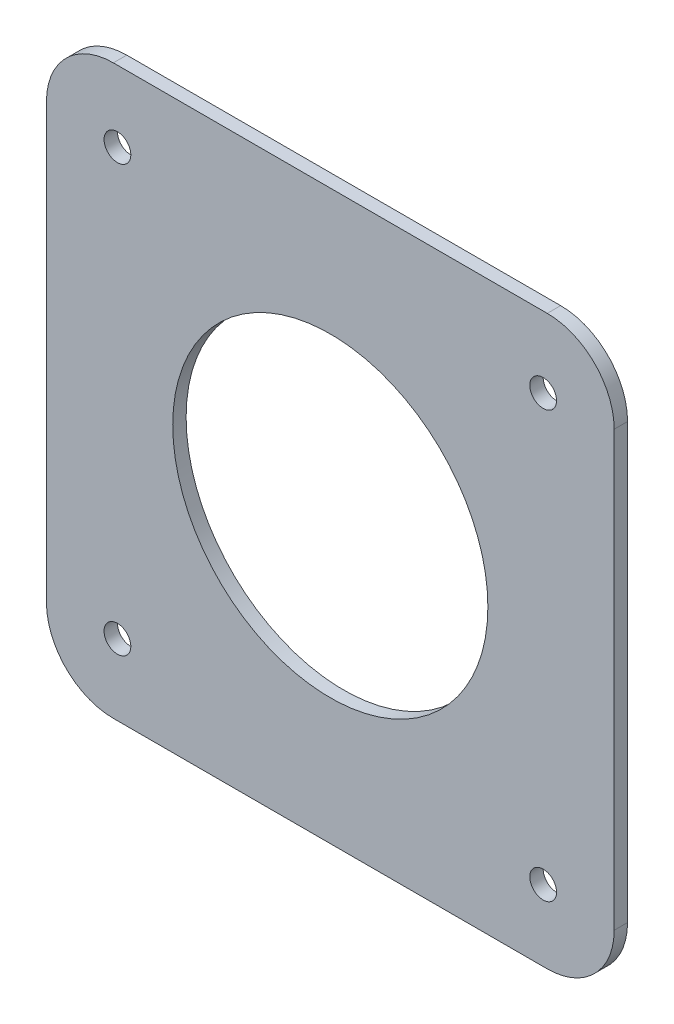
ISO-10303-21;
HEADER;
FILE_DESCRIPTION(('STEP AP214'),'2;1');
FILE_NAME('part.step','',(''),(''),'','','');
FILE_SCHEMA(('AUTOMOTIVE_DESIGN { 1 0 10303 214 1 1 1 1 }'));
ENDSEC;
DATA;
#1=APPLICATION_CONTEXT('core data for automotive mechanical design processes');
#2=APPLICATION_PROTOCOL_DEFINITION('international standard','automotive_design',2000,#1);
#3=PRODUCT_CONTEXT('',#1,'mechanical');
#4=PRODUCT('Part','Part','',(#3));
#5=PRODUCT_RELATED_PRODUCT_CATEGORY('part','',(#4));
#6=PRODUCT_DEFINITION_FORMATION('','',#4);
#7=PRODUCT_DEFINITION_CONTEXT('part definition',#1,'design');
#8=PRODUCT_DEFINITION('design','',#6,#7);
#9=PRODUCT_DEFINITION_SHAPE('','',#8);
#10=(LENGTH_UNIT() NAMED_UNIT(*) SI_UNIT(.MILLI.,.METRE.));
#11=(NAMED_UNIT(*) PLANE_ANGLE_UNIT() SI_UNIT($,.RADIAN.));
#12=(NAMED_UNIT(*) SI_UNIT($,.STERADIAN.) SOLID_ANGLE_UNIT());
#13=UNCERTAINTY_MEASURE_WITH_UNIT(LENGTH_MEASURE(1.E-05),#10,'distance_accuracy_value','');
#14=(GEOMETRIC_REPRESENTATION_CONTEXT(3) GLOBAL_UNCERTAINTY_ASSIGNED_CONTEXT((#13)) GLOBAL_UNIT_ASSIGNED_CONTEXT((#10,
#11,#12)) REPRESENTATION_CONTEXT('',''));
#15=CARTESIAN_POINT('',(0.,0.,0.));
#16=DIRECTION('',(0.,0.,1.));
#17=DIRECTION('',(1.,0.,0.));
#18=AXIS2_PLACEMENT_3D('',#15,#16,#17);
#19=CARTESIAN_POINT('',(59.3145246333828,55.4306557917285,2.));
#20=DIRECTION('',(0.,0.,-1.));
#21=DIRECTION('',(-1.,0.,0.));
#22=AXIS2_PLACEMENT_3D('',#19,#20,#21);
#23=PLANE('',#22);
#24=CARTESIAN_POINT('',(59.3145246333828,55.4306557917285,2.));
#25=DIRECTION('',(0.,0.,1.));
#26=DIRECTION('',(-1.,0.,0.));
#27=AXIS2_PLACEMENT_3D('',#24,#25,#26);
#28=CIRCLE('',#27,9.99999999999999);
#29=CARTESIAN_POINT('',(69.3145246333828,55.4306557917284,2.));
#30=VERTEX_POINT('',#29);
#31=CARTESIAN_POINT('',(59.3145246333827,65.4306557917285,2.));
#32=VERTEX_POINT('',#31);
#33=EDGE_CURVE('E145',#30,#32,#28,.T.);
#34=ORIENTED_EDGE('',*,*,#33,.T.);
#35=DIRECTION('',(-1.,0.,0.));
#36=VECTOR('',#35,1.);
#37=CARTESIAN_POINT('',(-5.53547536661714,65.4306557917285,2.));
#38=LINE('',#37,#36);
#39=CARTESIAN_POINT('',(-5.53547536661714,65.4306557917285,2.));
#40=VERTEX_POINT('',#39);
#41=EDGE_CURVE('E93',#32,#40,#38,.T.);
#42=ORIENTED_EDGE('',*,*,#41,.T.);
#43=CARTESIAN_POINT('',(-5.53547536661721,55.4306557917285,2.));
#44=DIRECTION('',(0.,0.,1.));
#45=DIRECTION('',(1.,0.,0.));
#46=AXIS2_PLACEMENT_3D('',#43,#44,#45);
#47=CIRCLE('',#46,10.);
#48=CARTESIAN_POINT('',(-15.5354753666172,55.4306557917284,2.));
#49=VERTEX_POINT('',#48);
#50=EDGE_CURVE('E160',#40,#49,#47,.T.);
#51=ORIENTED_EDGE('',*,*,#50,.T.);
#52=DIRECTION('',(0.,-1.,0.));
#53=VECTOR('',#52,1.);
#54=CARTESIAN_POINT('',(-15.5354753666172,55.4306557917284,2.));
#55=LINE('',#54,#53);
#56=CARTESIAN_POINT('',(-15.5354753666172,-9.41934420827146,2.));
#57=VERTEX_POINT('',#56);
#58=EDGE_CURVE('E173',#49,#57,#55,.T.);
#59=ORIENTED_EDGE('',*,*,#58,.T.);
#60=CARTESIAN_POINT('',(-5.5354753666172,-9.41934420827153,2.));
#61=DIRECTION('',(0.,0.,1.));
#62=DIRECTION('',(1.,0.,0.));
#63=AXIS2_PLACEMENT_3D('',#60,#61,#62);
#64=CIRCLE('',#63,10.);
#65=CARTESIAN_POINT('',(-5.53547536661713,-19.4193442082715,2.));
#66=VERTEX_POINT('',#65);
#67=EDGE_CURVE('E112',#57,#66,#64,.T.);
#68=ORIENTED_EDGE('',*,*,#67,.T.);
#69=DIRECTION('',(1.,0.,0.));
#70=VECTOR('',#69,1.);
#71=CARTESIAN_POINT('',(-5.53547536661713,-19.4193442082715,2.));
#72=LINE('',#71,#70);
#73=CARTESIAN_POINT('',(59.3145246333827,-19.4193442082715,2.));
#74=VERTEX_POINT('',#73);
#75=EDGE_CURVE('E106',#66,#74,#72,.T.);
#76=ORIENTED_EDGE('',*,*,#75,.T.);
#77=CARTESIAN_POINT('',(59.3145246333828,-9.41934420827153,2.));
#78=DIRECTION('',(0.,0.,1.));
#79=DIRECTION('',(1.,0.,0.));
#80=AXIS2_PLACEMENT_3D('',#77,#78,#79);
#81=CIRCLE('',#80,10.);
#82=CARTESIAN_POINT('',(69.3145246333828,-9.41934420827153,2.));
#83=VERTEX_POINT('',#82);
#84=EDGE_CURVE('E110',#74,#83,#81,.T.);
#85=ORIENTED_EDGE('',*,*,#84,.T.);
#86=DIRECTION('',(0.,1.,0.));
#87=VECTOR('',#86,1.);
#88=CARTESIAN_POINT('',(69.3145246333828,55.4306557917284,2.));
#89=LINE('',#88,#87);
#90=EDGE_CURVE('E50',#83,#30,#89,.T.);
#91=ORIENTED_EDGE('',*,*,#90,.T.);
#92=EDGE_LOOP('',(#34,#42,#51,#59,#68,#76,#85,#91));
#93=FACE_BOUND('',#92,.T.);
#94=CARTESIAN_POINT('',(26.8895246333828,23.0056557917285,2.));
#95=DIRECTION('',(0.,0.,1.));
#96=DIRECTION('',(1.,0.,0.));
#97=AXIS2_PLACEMENT_3D('',#94,#95,#96);
#98=CIRCLE('',#97,23.55);
#99=CARTESIAN_POINT('',(50.4395246333828,23.0056557917285,2.));
#100=VERTEX_POINT('',#99);
#101=EDGE_CURVE('E134',#100,#100,#98,.T.);
#102=ORIENTED_EDGE('',*,*,#101,.F.);
#103=EDGE_LOOP('',(#102));
#104=FACE_BOUND('',#103,.T.);
#105=CARTESIAN_POINT('',(-4.92547536661721,54.8206557917285,2.));
#106=DIRECTION('',(0.,0.,1.));
#107=DIRECTION('',(1.,0.,0.));
#108=AXIS2_PLACEMENT_3D('',#105,#106,#107);
#109=CIRCLE('',#108,2.);
#110=CARTESIAN_POINT('',(-2.92547536661721,54.8206557917285,2.));
#111=VERTEX_POINT('',#110);
#112=EDGE_CURVE('E182',#111,#111,#109,.T.);
#113=ORIENTED_EDGE('',*,*,#112,.F.);
#114=EDGE_LOOP('',(#113));
#115=FACE_BOUND('',#114,.T.);
#116=CARTESIAN_POINT('',(-4.92547536661721,-8.80934420827153,2.));
#117=DIRECTION('',(0.,0.,1.));
#118=DIRECTION('',(1.,0.,0.));
#119=AXIS2_PLACEMENT_3D('',#116,#117,#118);
#120=CIRCLE('',#119,2.);
#121=CARTESIAN_POINT('',(-2.92547536661721,-8.80934420827153,2.));
#122=VERTEX_POINT('',#121);
#123=EDGE_CURVE('E188',#122,#122,#120,.T.);
#124=ORIENTED_EDGE('',*,*,#123,.F.);
#125=EDGE_LOOP('',(#124));
#126=FACE_BOUND('',#125,.T.);
#127=CARTESIAN_POINT('',(58.7045246333828,54.8206557917285,2.));
#128=DIRECTION('',(0.,0.,1.));
#129=DIRECTION('',(1.,0.,0.));
#130=AXIS2_PLACEMENT_3D('',#127,#128,#129);
#131=CIRCLE('',#130,2.);
#132=CARTESIAN_POINT('',(60.7045246333828,54.8206557917285,2.));
#133=VERTEX_POINT('',#132);
#134=EDGE_CURVE('E194',#133,#133,#131,.T.);
#135=ORIENTED_EDGE('',*,*,#134,.F.);
#136=EDGE_LOOP('',(#135));
#137=FACE_BOUND('',#136,.T.);
#138=CARTESIAN_POINT('',(58.7045246333828,-8.80934420827153,2.));
#139=DIRECTION('',(0.,0.,1.));
#140=DIRECTION('',(1.,0.,0.));
#141=AXIS2_PLACEMENT_3D('',#138,#139,#140);
#142=CIRCLE('',#141,2.);
#143=CARTESIAN_POINT('',(60.7045246333828,-8.80934420827153,2.));
#144=VERTEX_POINT('',#143);
#145=EDGE_CURVE('E200',#144,#144,#142,.T.);
#146=ORIENTED_EDGE('',*,*,#145,.F.);
#147=EDGE_LOOP('',(#146));
#148=FACE_BOUND('',#147,.T.);
#149=ADVANCED_FACE('F33',(#93,#104,#115,#126,#137,#148),#23,.F.);
#150=CARTESIAN_POINT('',(59.3145246333828,55.4306557917285,0.));
#151=DIRECTION('',(0.,0.,-1.));
#152=DIRECTION('',(-1.,0.,0.));
#153=AXIS2_PLACEMENT_3D('',#150,#151,#152);
#154=PLANE('',#153);
#155=CARTESIAN_POINT('',(58.7045246333828,54.8206557917285,0.));
#156=DIRECTION('',(0.,0.,1.));
#157=DIRECTION('',(1.,0.,0.));
#158=AXIS2_PLACEMENT_3D('',#155,#156,#157);
#159=CIRCLE('',#158,2.);
#160=CARTESIAN_POINT('',(60.7045246333828,54.8206557917285,0.));
#161=VERTEX_POINT('',#160);
#162=EDGE_CURVE('E197',#161,#161,#159,.T.);
#163=ORIENTED_EDGE('',*,*,#162,.T.);
#164=EDGE_LOOP('',(#163));
#165=FACE_BOUND('',#164,.T.);
#166=CARTESIAN_POINT('',(-4.92547536661721,54.8206557917285,0.));
#167=DIRECTION('',(0.,0.,1.));
#168=DIRECTION('',(1.,0.,0.));
#169=AXIS2_PLACEMENT_3D('',#166,#167,#168);
#170=CIRCLE('',#169,2.);
#171=CARTESIAN_POINT('',(-2.92547536661721,54.8206557917285,0.));
#172=VERTEX_POINT('',#171);
#173=EDGE_CURVE('E185',#172,#172,#170,.T.);
#174=ORIENTED_EDGE('',*,*,#173,.T.);
#175=EDGE_LOOP('',(#174));
#176=FACE_BOUND('',#175,.T.);
#177=CARTESIAN_POINT('',(59.3145246333828,55.4306557917285,0.));
#178=DIRECTION('',(0.,0.,1.));
#179=DIRECTION('',(-1.,0.,0.));
#180=AXIS2_PLACEMENT_3D('',#177,#178,#179);
#181=CIRCLE('',#180,9.99999999999999);
#182=CARTESIAN_POINT('',(69.3145246333828,55.4306557917284,0.));
#183=VERTEX_POINT('',#182);
#184=CARTESIAN_POINT('',(59.3145246333827,65.4306557917285,0.));
#185=VERTEX_POINT('',#184);
#186=EDGE_CURVE('E130',#183,#185,#181,.T.);
#187=ORIENTED_EDGE('',*,*,#186,.F.);
#188=DIRECTION('',(0.,1.,0.));
#189=VECTOR('',#188,1.);
#190=CARTESIAN_POINT('',(69.3145246333828,55.4306557917284,0.));
#191=LINE('',#190,#189);
#192=CARTESIAN_POINT('',(69.3145246333828,-9.41934420827153,0.));
#193=VERTEX_POINT('',#192);
#194=EDGE_CURVE('E85',#193,#183,#191,.T.);
#195=ORIENTED_EDGE('',*,*,#194,.F.);
#196=CARTESIAN_POINT('',(59.3145246333828,-9.41934420827153,0.));
#197=DIRECTION('',(0.,0.,1.));
#198=DIRECTION('',(1.,0.,0.));
#199=AXIS2_PLACEMENT_3D('',#196,#197,#198);
#200=CIRCLE('',#199,10.);
#201=CARTESIAN_POINT('',(59.3145246333827,-19.4193442082715,0.));
#202=VERTEX_POINT('',#201);
#203=EDGE_CURVE('E79',#202,#193,#200,.T.);
#204=ORIENTED_EDGE('',*,*,#203,.F.);
#205=DIRECTION('',(1.,0.,0.));
#206=VECTOR('',#205,1.);
#207=CARTESIAN_POINT('',(-5.53547536661713,-19.4193442082715,0.));
#208=LINE('',#207,#206);
#209=CARTESIAN_POINT('',(-5.53547536661713,-19.4193442082715,0.));
#210=VERTEX_POINT('',#209);
#211=EDGE_CURVE('E120',#210,#202,#208,.T.);
#212=ORIENTED_EDGE('',*,*,#211,.F.);
#213=CARTESIAN_POINT('',(-5.5354753666172,-9.41934420827153,0.));
#214=DIRECTION('',(0.,0.,1.));
#215=DIRECTION('',(1.,0.,0.));
#216=AXIS2_PLACEMENT_3D('',#213,#214,#215);
#217=CIRCLE('',#216,10.);
#218=CARTESIAN_POINT('',(-15.5354753666172,-9.41934420827146,0.));
#219=VERTEX_POINT('',#218);
#220=EDGE_CURVE('E140',#219,#210,#217,.T.);
#221=ORIENTED_EDGE('',*,*,#220,.F.);
#222=DIRECTION('',(0.,-1.,0.));
#223=VECTOR('',#222,1.);
#224=CARTESIAN_POINT('',(-15.5354753666172,55.4306557917284,0.));
#225=LINE('',#224,#223);
#226=CARTESIAN_POINT('',(-15.5354753666172,55.4306557917284,0.));
#227=VERTEX_POINT('',#226);
#228=EDGE_CURVE('E138',#227,#219,#225,.T.);
#229=ORIENTED_EDGE('',*,*,#228,.F.);
#230=CARTESIAN_POINT('',(-5.53547536661721,55.4306557917285,0.));
#231=DIRECTION('',(0.,0.,1.));
#232=DIRECTION('',(1.,0.,0.));
#233=AXIS2_PLACEMENT_3D('',#230,#231,#232);
#234=CIRCLE('',#233,10.);
#235=CARTESIAN_POINT('',(-5.53547536661714,65.4306557917285,0.));
#236=VERTEX_POINT('',#235);
#237=EDGE_CURVE('E136',#236,#227,#234,.T.);
#238=ORIENTED_EDGE('',*,*,#237,.F.);
#239=DIRECTION('',(-1.,0.,0.));
#240=VECTOR('',#239,1.);
#241=CARTESIAN_POINT('',(-5.53547536661714,65.4306557917285,0.));
#242=LINE('',#241,#240);
#243=EDGE_CURVE('E133',#185,#236,#242,.T.);
#244=ORIENTED_EDGE('',*,*,#243,.F.);
#245=EDGE_LOOP('',(#187,#195,#204,#212,#221,#229,#238,#244));
#246=FACE_BOUND('',#245,.T.);
#247=CARTESIAN_POINT('',(26.8895246333828,23.0056557917285,0.));
#248=DIRECTION('',(0.,0.,1.));
#249=DIRECTION('',(1.,0.,0.));
#250=AXIS2_PLACEMENT_3D('',#247,#248,#249);
#251=CIRCLE('',#250,23.55);
#252=CARTESIAN_POINT('',(50.4395246333828,23.0056557917285,0.));
#253=VERTEX_POINT('',#252);
#254=EDGE_CURVE('E179',#253,#253,#251,.T.);
#255=ORIENTED_EDGE('',*,*,#254,.T.);
#256=EDGE_LOOP('',(#255));
#257=FACE_BOUND('',#256,.T.);
#258=CARTESIAN_POINT('',(-4.92547536661721,-8.80934420827153,0.));
#259=DIRECTION('',(0.,0.,1.));
#260=DIRECTION('',(1.,0.,0.));
#261=AXIS2_PLACEMENT_3D('',#258,#259,#260);
#262=CIRCLE('',#261,2.);
#263=CARTESIAN_POINT('',(-2.92547536661721,-8.80934420827153,0.));
#264=VERTEX_POINT('',#263);
#265=EDGE_CURVE('E191',#264,#264,#262,.T.);
#266=ORIENTED_EDGE('',*,*,#265,.T.);
#267=EDGE_LOOP('',(#266));
#268=FACE_BOUND('',#267,.T.);
#269=CARTESIAN_POINT('',(58.7045246333828,-8.80934420827153,0.));
#270=DIRECTION('',(0.,0.,1.));
#271=DIRECTION('',(1.,0.,0.));
#272=AXIS2_PLACEMENT_3D('',#269,#270,#271);
#273=CIRCLE('',#272,2.);
#274=CARTESIAN_POINT('',(60.7045246333828,-8.80934420827153,0.));
#275=VERTEX_POINT('',#274);
#276=EDGE_CURVE('E203',#275,#275,#273,.T.);
#277=ORIENTED_EDGE('',*,*,#276,.T.);
#278=EDGE_LOOP('',(#277));
#279=FACE_BOUND('',#278,.T.);
#280=ADVANCED_FACE('F164',(#165,#176,#246,#257,#268,#279),#154,.T.);
#281=CARTESIAN_POINT('',(59.3145246333828,55.4306557917285,2.));
#282=DIRECTION('',(0.,0.,-1.));
#283=DIRECTION('',(-1.,0.,0.));
#284=AXIS2_PLACEMENT_3D('',#281,#282,#283);
#285=CYLINDRICAL_SURFACE('',#284,9.99999999999999);
#286=ORIENTED_EDGE('',*,*,#186,.T.);
#287=DIRECTION('',(0.,0.,-1.));
#288=VECTOR('',#287,1.);
#289=CARTESIAN_POINT('',(59.3145246333827,65.4306557917285,2.));
#290=LINE('',#289,#288);
#291=EDGE_CURVE('E11',#32,#185,#290,.T.);
#292=ORIENTED_EDGE('',*,*,#291,.F.);
#293=ORIENTED_EDGE('',*,*,#33,.F.);
#294=DIRECTION('',(0.,0.,-1.));
#295=VECTOR('',#294,1.);
#296=CARTESIAN_POINT('',(69.3145246333828,55.4306557917284,2.));
#297=LINE('',#296,#295);
#298=EDGE_CURVE('E126',#30,#183,#297,.T.);
#299=ORIENTED_EDGE('',*,*,#298,.T.);
#300=EDGE_LOOP('',(#286,#292,#293,#299));
#301=FACE_BOUND('',#300,.T.);
#302=ADVANCED_FACE('F35',(#301),#285,.T.);
#303=CARTESIAN_POINT('',(-5.53547536661714,65.4306557917285,2.));
#304=DIRECTION('',(0.,-1.,0.));
#305=DIRECTION('',(0.,0.,-1.));
#306=AXIS2_PLACEMENT_3D('',#303,#304,#305);
#307=PLANE('',#306);
#308=ORIENTED_EDGE('',*,*,#243,.T.);
#309=DIRECTION('',(0.,0.,-1.));
#310=VECTOR('',#309,1.);
#311=CARTESIAN_POINT('',(-5.53547536661714,65.4306557917285,2.));
#312=LINE('',#311,#310);
#313=EDGE_CURVE('E42',#40,#236,#312,.T.);
#314=ORIENTED_EDGE('',*,*,#313,.F.);
#315=ORIENTED_EDGE('',*,*,#41,.F.);
#316=ORIENTED_EDGE('',*,*,#291,.T.);
#317=EDGE_LOOP('',(#308,#314,#315,#316));
#318=FACE_BOUND('',#317,.T.);
#319=ADVANCED_FACE('F235',(#318),#307,.F.);
#320=CARTESIAN_POINT('',(-5.53547536661721,55.4306557917285,2.));
#321=DIRECTION('',(0.,0.,-1.));
#322=DIRECTION('',(-1.,0.,0.));
#323=AXIS2_PLACEMENT_3D('',#320,#321,#322);
#324=CYLINDRICAL_SURFACE('',#323,10.);
#325=ORIENTED_EDGE('',*,*,#237,.T.);
#326=DIRECTION('',(0.,0.,-1.));
#327=VECTOR('',#326,1.);
#328=CARTESIAN_POINT('',(-15.5354753666172,55.4306557917284,2.));
#329=LINE('',#328,#327);
#330=EDGE_CURVE('E152',#49,#227,#329,.T.);
#331=ORIENTED_EDGE('',*,*,#330,.F.);
#332=ORIENTED_EDGE('',*,*,#50,.F.);
#333=ORIENTED_EDGE('',*,*,#313,.T.);
#334=EDGE_LOOP('',(#325,#331,#332,#333));
#335=FACE_BOUND('',#334,.T.);
#336=ADVANCED_FACE('F158',(#335),#324,.T.);
#337=CARTESIAN_POINT('',(-15.5354753666172,55.4306557917284,2.));
#338=DIRECTION('',(1.,0.,0.));
#339=DIRECTION('',(0.,1.,0.));
#340=AXIS2_PLACEMENT_3D('',#337,#338,#339);
#341=PLANE('',#340);
#342=ORIENTED_EDGE('',*,*,#228,.T.);
#343=DIRECTION('',(0.,0.,-1.));
#344=VECTOR('',#343,1.);
#345=CARTESIAN_POINT('',(-15.5354753666172,-9.41934420827146,2.));
#346=LINE('',#345,#344);
#347=EDGE_CURVE('E149',#57,#219,#346,.T.);
#348=ORIENTED_EDGE('',*,*,#347,.F.);
#349=ORIENTED_EDGE('',*,*,#58,.F.);
#350=ORIENTED_EDGE('',*,*,#330,.T.);
#351=EDGE_LOOP('',(#342,#348,#349,#350));
#352=FACE_BOUND('',#351,.T.);
#353=ADVANCED_FACE('F169',(#352),#341,.F.);
#354=CARTESIAN_POINT('',(-5.5354753666172,-9.41934420827153,2.));
#355=DIRECTION('',(0.,0.,-1.));
#356=DIRECTION('',(-1.,0.,0.));
#357=AXIS2_PLACEMENT_3D('',#354,#355,#356);
#358=CYLINDRICAL_SURFACE('',#357,10.);
#359=ORIENTED_EDGE('',*,*,#220,.T.);
#360=DIRECTION('',(0.,0.,-1.));
#361=VECTOR('',#360,1.);
#362=CARTESIAN_POINT('',(-5.53547536661713,-19.4193442082715,2.));
#363=LINE('',#362,#361);
#364=EDGE_CURVE('E121',#66,#210,#363,.T.);
#365=ORIENTED_EDGE('',*,*,#364,.F.);
#366=ORIENTED_EDGE('',*,*,#67,.F.);
#367=ORIENTED_EDGE('',*,*,#347,.T.);
#368=EDGE_LOOP('',(#359,#365,#366,#367));
#369=FACE_BOUND('',#368,.T.);
#370=ADVANCED_FACE('F172',(#369),#358,.T.);
#371=CARTESIAN_POINT('',(-5.53547536661713,-19.4193442082715,2.));
#372=DIRECTION('',(0.,1.,0.));
#373=DIRECTION('',(0.,0.,1.));
#374=AXIS2_PLACEMENT_3D('',#371,#372,#373);
#375=PLANE('',#374);
#376=ORIENTED_EDGE('',*,*,#211,.T.);
#377=DIRECTION('',(0.,0.,-1.));
#378=VECTOR('',#377,1.);
#379=CARTESIAN_POINT('',(59.3145246333827,-19.4193442082715,2.));
#380=LINE('',#379,#378);
#381=EDGE_CURVE('E117',#74,#202,#380,.T.);
#382=ORIENTED_EDGE('',*,*,#381,.F.);
#383=ORIENTED_EDGE('',*,*,#75,.F.);
#384=ORIENTED_EDGE('',*,*,#364,.T.);
#385=EDGE_LOOP('',(#376,#382,#383,#384));
#386=FACE_BOUND('',#385,.T.);
#387=ADVANCED_FACE('F118',(#386),#375,.F.);
#388=CARTESIAN_POINT('',(59.3145246333828,-9.41934420827153,2.));
#389=DIRECTION('',(0.,0.,-1.));
#390=DIRECTION('',(-1.,0.,0.));
#391=AXIS2_PLACEMENT_3D('',#388,#389,#390);
#392=CYLINDRICAL_SURFACE('',#391,10.);
#393=ORIENTED_EDGE('',*,*,#203,.T.);
#394=DIRECTION('',(0.,0.,-1.));
#395=VECTOR('',#394,1.);
#396=CARTESIAN_POINT('',(69.3145246333828,-9.41934420827153,2.));
#397=LINE('',#396,#395);
#398=EDGE_CURVE('E122',#83,#193,#397,.T.);
#399=ORIENTED_EDGE('',*,*,#398,.F.);
#400=ORIENTED_EDGE('',*,*,#84,.F.);
#401=ORIENTED_EDGE('',*,*,#381,.T.);
#402=EDGE_LOOP('',(#393,#399,#400,#401));
#403=FACE_BOUND('',#402,.T.);
#404=ADVANCED_FACE('F124',(#403),#392,.T.);
#405=CARTESIAN_POINT('',(69.3145246333828,55.4306557917284,2.));
#406=DIRECTION('',(-1.,0.,0.));
#407=DIRECTION('',(0.,0.,1.));
#408=AXIS2_PLACEMENT_3D('',#405,#406,#407);
#409=PLANE('',#408);
#410=ORIENTED_EDGE('',*,*,#194,.T.);
#411=ORIENTED_EDGE('',*,*,#298,.F.);
#412=ORIENTED_EDGE('',*,*,#90,.F.);
#413=ORIENTED_EDGE('',*,*,#398,.T.);
#414=EDGE_LOOP('',(#410,#411,#412,#413));
#415=FACE_BOUND('',#414,.T.);
#416=ADVANCED_FACE('F223',(#415),#409,.F.);
#417=CARTESIAN_POINT('',(26.8895246333828,23.0056557917285,2.));
#418=DIRECTION('',(0.,0.,-1.));
#419=DIRECTION('',(-1.,0.,0.));
#420=AXIS2_PLACEMENT_3D('',#417,#418,#419);
#421=CYLINDRICAL_SURFACE('',#420,23.55);
#422=ORIENTED_EDGE('',*,*,#101,.T.);
#423=EDGE_LOOP('',(#422));
#424=FACE_BOUND('',#423,.T.);
#425=ORIENTED_EDGE('',*,*,#254,.F.);
#426=EDGE_LOOP('',(#425));
#427=FACE_BOUND('',#426,.T.);
#428=ADVANCED_FACE('F220',(#424,#427),#421,.F.);
#429=CARTESIAN_POINT('',(-4.92547536661721,54.8206557917285,2.));
#430=DIRECTION('',(0.,0.,-1.));
#431=DIRECTION('',(-1.,0.,0.));
#432=AXIS2_PLACEMENT_3D('',#429,#430,#431);
#433=CYLINDRICAL_SURFACE('',#432,2.);
#434=ORIENTED_EDGE('',*,*,#112,.T.);
#435=EDGE_LOOP('',(#434));
#436=FACE_BOUND('',#435,.T.);
#437=ORIENTED_EDGE('',*,*,#173,.F.);
#438=EDGE_LOOP('',(#437));
#439=FACE_BOUND('',#438,.T.);
#440=ADVANCED_FACE('F299',(#436,#439),#433,.F.);
#441=CARTESIAN_POINT('',(-4.92547536661721,-8.80934420827153,2.));
#442=DIRECTION('',(0.,0.,-1.));
#443=DIRECTION('',(-1.,0.,0.));
#444=AXIS2_PLACEMENT_3D('',#441,#442,#443);
#445=CYLINDRICAL_SURFACE('',#444,2.);
#446=ORIENTED_EDGE('',*,*,#123,.T.);
#447=EDGE_LOOP('',(#446));
#448=FACE_BOUND('',#447,.T.);
#449=ORIENTED_EDGE('',*,*,#265,.F.);
#450=EDGE_LOOP('',(#449));
#451=FACE_BOUND('',#450,.T.);
#452=ADVANCED_FACE('F307',(#448,#451),#445,.F.);
#453=CARTESIAN_POINT('',(58.7045246333828,54.8206557917285,2.));
#454=DIRECTION('',(0.,0.,-1.));
#455=DIRECTION('',(-1.,0.,0.));
#456=AXIS2_PLACEMENT_3D('',#453,#454,#455);
#457=CYLINDRICAL_SURFACE('',#456,2.);
#458=ORIENTED_EDGE('',*,*,#134,.T.);
#459=EDGE_LOOP('',(#458));
#460=FACE_BOUND('',#459,.T.);
#461=ORIENTED_EDGE('',*,*,#162,.F.);
#462=EDGE_LOOP('',(#461));
#463=FACE_BOUND('',#462,.T.);
#464=ADVANCED_FACE('F315',(#460,#463),#457,.F.);
#465=CARTESIAN_POINT('',(58.7045246333828,-8.80934420827153,2.));
#466=DIRECTION('',(0.,0.,-1.));
#467=DIRECTION('',(-1.,0.,0.));
#468=AXIS2_PLACEMENT_3D('',#465,#466,#467);
#469=CYLINDRICAL_SURFACE('',#468,2.);
#470=ORIENTED_EDGE('',*,*,#145,.T.);
#471=EDGE_LOOP('',(#470));
#472=FACE_BOUND('',#471,.T.);
#473=ORIENTED_EDGE('',*,*,#276,.F.);
#474=EDGE_LOOP('',(#473));
#475=FACE_BOUND('',#474,.T.);
#476=ADVANCED_FACE('F209',(#472,#475),#469,.F.);
#477=CLOSED_SHELL('',(#149,#280,#302,#319,#336,#353,#370,#387,#404,#416,#428,#440,#452,#464,#476));
#478=MANIFOLD_SOLID_BREP('B2',#477);
#479=ADVANCED_BREP_SHAPE_REPRESENTATION('',(#18,#478),#14);
#480=SHAPE_DEFINITION_REPRESENTATION(#9,#479);
ENDSEC;
END-ISO-10303-21;
